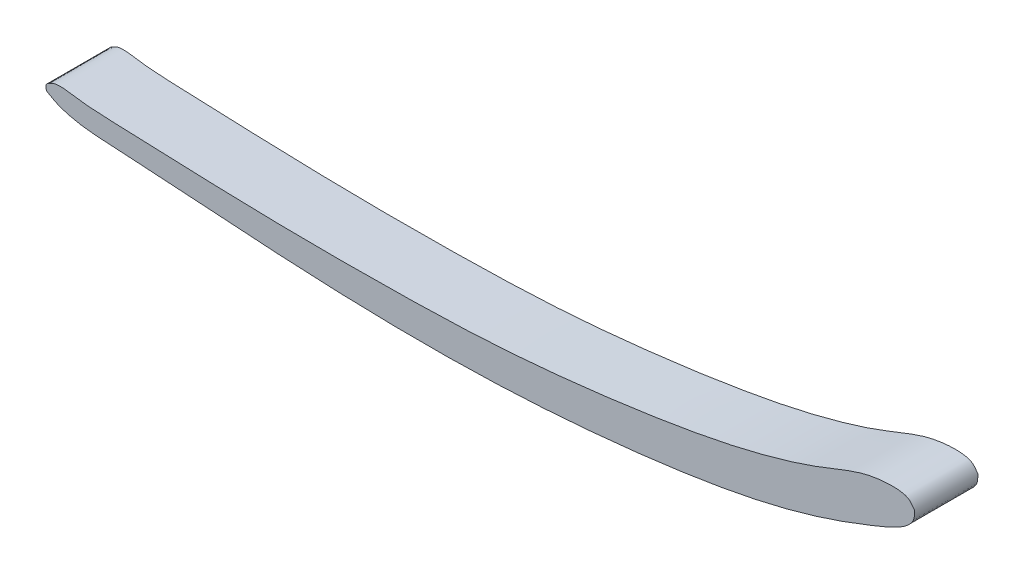
ISO-10303-21;
HEADER;
FILE_DESCRIPTION(('STEP AP214'),'2;1');
FILE_NAME('part.step','',(''),(''),'','','');
FILE_SCHEMA(('AUTOMOTIVE_DESIGN { 1 0 10303 214 1 1 1 1 }'));
ENDSEC;
DATA;
#1=APPLICATION_CONTEXT('core data for automotive mechanical design processes');
#2=APPLICATION_PROTOCOL_DEFINITION('international standard','automotive_design',2000,#1);
#3=PRODUCT_CONTEXT('',#1,'mechanical');
#4=PRODUCT('Part','Part','',(#3));
#5=PRODUCT_RELATED_PRODUCT_CATEGORY('part','',(#4));
#6=PRODUCT_DEFINITION_FORMATION('','',#4);
#7=PRODUCT_DEFINITION_CONTEXT('part definition',#1,'design');
#8=PRODUCT_DEFINITION('design','',#6,#7);
#9=PRODUCT_DEFINITION_SHAPE('','',#8);
#10=(LENGTH_UNIT() NAMED_UNIT(*) SI_UNIT(.MILLI.,.METRE.));
#11=(NAMED_UNIT(*) PLANE_ANGLE_UNIT() SI_UNIT($,.RADIAN.));
#12=(NAMED_UNIT(*) SI_UNIT($,.STERADIAN.) SOLID_ANGLE_UNIT());
#13=UNCERTAINTY_MEASURE_WITH_UNIT(LENGTH_MEASURE(1.E-05),#10,'distance_accuracy_value','');
#14=(GEOMETRIC_REPRESENTATION_CONTEXT(3) GLOBAL_UNCERTAINTY_ASSIGNED_CONTEXT((#13)) GLOBAL_UNIT_ASSIGNED_CONTEXT((#10,
#11,#12)) REPRESENTATION_CONTEXT('',''));
#15=CARTESIAN_POINT('',(0.,0.,0.));
#16=DIRECTION('',(0.,0.,1.));
#17=DIRECTION('',(1.,0.,0.));
#18=AXIS2_PLACEMENT_3D('',#15,#16,#17);
#19=CARTESIAN_POINT('',(41.656059354122,0.,476.));
#20=CARTESIAN_POINT('',(41.6411622522607,0.0745656319227003,476.));
#21=CARTESIAN_POINT('',(41.599875086542,0.138136223866402,476.));
#22=CARTESIAN_POINT('',(41.5123259849444,0.2598381366931,476.));
#23=CARTESIAN_POINT('',(41.4649652367241,0.317921392325511,476.));
#24=CARTESIAN_POINT('',(41.326790070313,0.495186504517943,476.));
#25=CARTESIAN_POINT('',(41.2353961147345,0.615123243591371,476.));
#26=CARTESIAN_POINT('',(41.0801421065875,0.775409706172896,476.));
#27=CARTESIAN_POINT('',(41.0257568422842,0.825777786115256,476.));
#28=CARTESIAN_POINT('',(40.9077762239397,0.915811415103947,476.));
#29=CARTESIAN_POINT('',(40.8440565762179,0.956041321608349,476.));
#30=CARTESIAN_POINT('',(40.6443731332833,1.06202801774388,476.));
#31=CARTESIAN_POINT('',(40.5040778067732,1.11172794332347,476.));
#32=CARTESIAN_POINT('',(40.2166389891778,1.19111910483424,476.));
#33=CARTESIAN_POINT('',(40.0688358258273,1.22020192061145,476.));
#34=CARTESIAN_POINT('',(39.7744975728023,1.26679206205951,476.));
#35=CARTESIAN_POINT('',(39.6271339065498,1.28400075489716,476.));
#36=CARTESIAN_POINT('',(39.1845310386129,1.31961247431741,476.));
#37=CARTESIAN_POINT('',(38.8888272142589,1.32347929795409,476.));
#38=CARTESIAN_POINT('',(38.0008155499215,1.30691634954785,476.));
#39=CARTESIAN_POINT('',(37.4057200585186,1.25289002388385,476.));
#40=CARTESIAN_POINT('',(36.2396160438054,1.08112770334556,476.));
#41=CARTESIAN_POINT('',(35.6656226189178,0.960683708931348,476.));
#42=CARTESIAN_POINT('',(33.9691559768438,0.502004987980635,476.));
#43=CARTESIAN_POINT('',(32.8697564376551,0.0750670066635498,476.));
#44=CARTESIAN_POINT('',(30.6760232761779,-0.795078602450539,476.));
#45=CARTESIAN_POINT('',(29.578746017737,-1.22884511673044,476.));
#46=CARTESIAN_POINT('',(27.3584199363584,-2.01440353612838,476.));
#47=CARTESIAN_POINT('',(26.2366581381468,-2.37028923031119,476.));
#48=CARTESIAN_POINT('',(23.9777292995895,-3.03305937534354,476.));
#49=CARTESIAN_POINT('',(22.840608045447,-3.34008946368883,476.));
#50=CARTESIAN_POINT('',(20.5550172725716,-3.91805289683216,476.));
#51=CARTESIAN_POINT('',(19.4055542832042,-4.18781663477288,476.));
#52=CARTESIAN_POINT('',(17.0995406477047,-4.68868418109729,476.));
#53=CARTESIAN_POINT('',(15.942732773791,-4.9203970810676,476.));
#54=CARTESIAN_POINT('',(12.4634363422635,-5.57183562509925,476.));
#55=CARTESIAN_POINT('',(10.1335971690307,-5.94986010040581,476.));
#56=CARTESIAN_POINT('',(5.46603753228869,-6.63936713804074,476.));
#57=CARTESIAN_POINT('',(3.12707920104473,-6.94844879440594,476.));
#58=CARTESIAN_POINT('',(-1.55974353162863,-7.50526319897706,476.));
#59=CARTESIAN_POINT('',(-3.90610999950208,-7.75298394646187,476.));
#60=CARTESIAN_POINT('',(-8.60582037120204,-8.16740204432664,476.));
#61=CARTESIAN_POINT('',(-10.9599295218898,-8.33242329183359,476.));
#62=CARTESIAN_POINT('',(-15.67344338439,-8.57736018992779,476.));
#63=CARTESIAN_POINT('',(-18.0314796863121,-8.65834342906753,476.));
#64=CARTESIAN_POINT('',(-22.7490104826822,-8.77302617296814,476.));
#65=CARTESIAN_POINT('',(-25.1086511613516,-8.80764244933431,476.));
#66=CARTESIAN_POINT('',(-29.8278964468394,-8.84634896351519,476.));
#67=CARTESIAN_POINT('',(-32.1874991251422,-8.84987628324567,476.));
#68=CARTESIAN_POINT('',(-36.9066541166952,-8.81700623053736,476.));
#69=CARTESIAN_POINT('',(-39.2663221859982,-8.78042927846728,476.));
#70=CARTESIAN_POINT('',(-43.9846166213349,-8.66992138592197,476.));
#71=CARTESIAN_POINT('',(-46.3433874207373,-8.59766558309423,476.));
#72=CARTESIAN_POINT('',(-51.0603442514039,-8.43764624387444,476.));
#73=CARTESIAN_POINT('',(-53.4186054472226,-8.35126682536733,476.));
#74=CARTESIAN_POINT('',(-56.9557665851521,-8.21587135787692,476.));
#75=CARTESIAN_POINT('',(-58.1347421032148,-8.16864059808202,476.));
#76=CARTESIAN_POINT('',(-59.9029633549886,-8.09218229887949,476.));
#77=CARTESIAN_POINT('',(-60.4924285244922,-8.06803312977843,476.));
#78=CARTESIAN_POINT('',(-61.6709665667264,-8.01070546653201,476.));
#79=CARTESIAN_POINT('',(-62.2598059278311,-7.9775877836907,476.));
#80=CARTESIAN_POINT('',(-63.4338481910908,-7.87548598580615,476.));
#81=CARTESIAN_POINT('',(-64.0190929900461,-7.80682172094238,476.));
#82=CARTESIAN_POINT('',(-64.8940635688195,-7.67510366427916,476.));
#83=CARTESIAN_POINT('',(-65.1854095246835,-7.6272478613896,476.));
#84=CARTESIAN_POINT('',(-65.7698363240156,-7.55314007612264,476.));
#85=CARTESIAN_POINT('',(-66.0626183769325,-7.52424586474919,476.));
#86=CARTESIAN_POINT('',(-66.5047346030952,-7.52313615306412,476.));
#87=CARTESIAN_POINT('',(-66.6535199274021,-7.5305442849246,476.));
#88=CARTESIAN_POINT('',(-66.9434646290674,-7.5701911016053,476.));
#89=CARTESIAN_POINT('',(-67.0852210506699,-7.6028825472795,476.));
#90=CARTESIAN_POINT('',(-67.3605662392593,-7.70094702985738,476.));
#91=CARTESIAN_POINT('',(-67.495029956487,-7.76567761164343,476.));
#92=CARTESIAN_POINT('',(-67.690375139116,-7.87235235935607,476.));
#93=CARTESIAN_POINT('',(-67.7542955794921,-7.91016965677373,476.));
#94=CARTESIAN_POINT('',(-67.8812029114201,-7.98724058513402,476.));
#95=CARTESIAN_POINT('',(-67.946756447238,-8.02358480506687,476.));
#96=CARTESIAN_POINT('',(-68.0604178682852,-8.11896236430099,476.));
#97=CARTESIAN_POINT('',(-68.1031390541075,-8.18234620854449,476.));
#98=CARTESIAN_POINT('',(-68.1497657523376,-8.32279274417433,476.));
#99=CARTESIAN_POINT('',(-68.1521672319965,-8.3980544622457,476.));
#100=CARTESIAN_POINT('',(-68.1456758272637,-8.54602106392083,476.));
#101=CARTESIAN_POINT('',(-68.1408314720423,-8.61996481679637,476.));
#102=CARTESIAN_POINT('',(-68.1133539909969,-8.76583308748999,476.));
#103=CARTESIAN_POINT('',(-68.0892783598684,-8.83837355292791,476.));
#104=CARTESIAN_POINT('',(-67.9999361897581,-8.95506582215182,476.));
#105=CARTESIAN_POINT('',(-67.9356000885031,-8.99589850782444,476.));
#106=CARTESIAN_POINT('',(-67.805910734232,-9.0648906723025,476.));
#107=CARTESIAN_POINT('',(-67.7388156405487,-9.09560635467722,476.));
#108=CARTESIAN_POINT('',(-67.5425508665902,-9.19668334028624,476.));
#109=CARTESIAN_POINT('',(-67.4148041969059,-9.26988178846623,476.));
#110=CARTESIAN_POINT('',(-67.158948345859,-9.41559805884382,476.));
#111=CARTESIAN_POINT('',(-67.0306351924745,-9.48773291777123,476.));
#112=CARTESIAN_POINT('',(-66.7668938248642,-9.61864390661332,476.));
#113=CARTESIAN_POINT('',(-66.6319824929752,-9.67822481677409,476.));
#114=CARTESIAN_POINT('',(-66.2249072503164,-9.84226703451248,476.));
#115=CARTESIAN_POINT('',(-65.9487295406194,-9.93329791509154,476.));
#116=CARTESIAN_POINT('',(-65.1134960361629,-10.180771785631,476.));
#117=CARTESIAN_POINT('',(-64.5464709422099,-10.306744295727,476.));
#118=CARTESIAN_POINT('',(-63.3967441582376,-10.4987501176073,476.));
#119=CARTESIAN_POINT('',(-62.8151038624989,-10.5657214750018,476.));
#120=CARTESIAN_POINT('',(-61.6528623207659,-10.6744206370753,476.));
#121=CARTESIAN_POINT('',(-61.0706236880044,-10.7155050787344,476.));
#122=CARTESIAN_POINT('',(-59.3227143719973,-10.8245966789952,476.));
#123=CARTESIAN_POINT('',(-58.156263719605,-10.8818951120884,476.));
#124=CARTESIAN_POINT('',(-55.8243033074842,-11.0088004190595,476.));
#125=CARTESIAN_POINT('',(-54.6585529405531,-11.0762239556743,476.));
#126=CARTESIAN_POINT('',(-51.1622136842119,-11.2942483136256,476.));
#127=CARTESIAN_POINT('',(-48.8324862834028,-11.4589533308981,476.));
#128=CARTESIAN_POINT('',(-44.1723865725282,-11.7773556738059,476.));
#129=CARTESIAN_POINT('',(-41.8419674291939,-11.930783494679,476.));
#130=CARTESIAN_POINT('',(-34.8474546045703,-12.3401729676022,476.));
#131=CARTESIAN_POINT('',(-30.1806486247097,-12.5426048718411,476.));
#132=CARTESIAN_POINT('',(-20.8416240165399,-12.7179494924376,476.));
#133=CARTESIAN_POINT('',(-16.1690919982502,-12.6949028197688,476.));
#134=CARTESIAN_POINT('',(-6.83623551571093,-12.357347440748,476.));
#135=CARTESIAN_POINT('',(-2.17229057516247,-12.0417791305582,476.));
#136=CARTESIAN_POINT('',(4.80181468854188,-11.3640376476286,476.));
#137=CARTESIAN_POINT('',(7.12228826971774,-11.1053914487185,476.));
#138=CARTESIAN_POINT('',(11.7531576902196,-10.5100822911382,476.));
#139=CARTESIAN_POINT('',(14.0638902593571,-10.1760261236726,476.));
#140=CARTESIAN_POINT('',(18.6709487306098,-9.39638468859501,476.));
#141=CARTESIAN_POINT('',(20.9639632760597,-8.95092856593287,476.));
#142=CARTESIAN_POINT('',(25.5135538698548,-7.89308161396524,476.));
#143=CARTESIAN_POINT('',(27.7701892147909,-7.27959159094672,476.));
#144=CARTESIAN_POINT('',(32.2211886981447,-5.85692748123369,476.));
#145=CARTESIAN_POINT('',(34.4162467818469,-5.04911056546946,476.));
#146=CARTESIAN_POINT('',(37.1222366744191,-3.94845302059224,476.));
#147=CARTESIAN_POINT('',(37.6617464458415,-3.72375013637632,476.));
#148=CARTESIAN_POINT('',(38.4626559292222,-3.36826927435174,476.));
#149=CARTESIAN_POINT('',(38.7279907450688,-3.24611983525079,476.));
#150=CARTESIAN_POINT('',(39.2529751137952,-2.98910894650334,476.));
#151=CARTESIAN_POINT('',(39.5122734451977,-2.85516349103267,476.));
#152=CARTESIAN_POINT('',(40.0166977288432,-2.56429610084689,476.));
#153=CARTESIAN_POINT('',(40.2619563483756,-2.40748643047174,476.));
#154=CARTESIAN_POINT('',(40.7282112575348,-2.05417387327939,476.));
#155=CARTESIAN_POINT('',(40.9471359407931,-1.8566546011801,476.));
#156=CARTESIAN_POINT('',(41.232491221487,-1.52381870305079,476.));
#157=CARTESIAN_POINT('',(41.3217412958915,-1.40529627296967,476.));
#158=CARTESIAN_POINT('',(41.4718600188819,-1.15447379668126,476.));
#159=CARTESIAN_POINT('',(41.5338656004132,-1.0223078565062,476.));
#160=CARTESIAN_POINT('',(41.6073471046207,-0.734336539151004,476.));
#161=CARTESIAN_POINT('',(41.6153338099253,-0.586874343492506,476.));
#162=CARTESIAN_POINT('',(41.6313611160118,-0.366170386615065,476.));
#163=CARTESIAN_POINT('',(41.6400074358257,-0.293001860465603,476.));
#164=CARTESIAN_POINT('',(41.6586089320643,-0.146823056793075,476.));
#165=CARTESIAN_POINT('',(41.6709564559833,-0.0745656319227003,476.));
#166=CARTESIAN_POINT('',(41.656059354122,0.,476.));
#167=B_SPLINE_CURVE_WITH_KNOTS('',3,(#19,#20,#21,#22,#23,#24,#25,#26,#27,#28,#29,#30,#31,#32,
#33,#34,#35,#36,#37,#38,#39,#40,#41,#42,#43,#44,#45,#46,#47,#48,#49,#50,#51,#52,#53,#54,#55,#56,
#57,#58,#59,#60,#61,#62,#63,#64,#65,#66,#67,#68,#69,#70,#71,#72,#73,#74,#75,#76,#77,#78,#79,#80,
#81,#82,#83,#84,#85,#86,#87,#88,#89,#90,#91,#92,#93,#94,#95,#96,#97,#98,#99,#100,#101,#102,#103,
#104,#105,#106,#107,#108,#109,#110,#111,#112,#113,#114,#115,#116,#117,#118,#119,#120,#121,#122,
#123,#124,#125,#126,#127,#128,#129,#130,#131,#132,#133,#134,#135,#136,#137,#138,#139,#140,#141,
#142,#143,#144,#145,#146,#147,#148,#149,#150,#151,#152,#153,#154,#155,#156,#157,#158,#159,#160,
#161,#162,#163,#164,#165,#166),.UNSPECIFIED.,.T.,.F.,(4,2,2,2,2,2,2,2,2,2,2,2,2,2,2,2,2,2,2,2,2,
2,2,2,2,2,2,2,2,2,2,2,2,2,2,2,2,2,2,2,2,2,2,2,2,2,2,2,2,2,2,2,2,2,2,2,2,2,2,2,2,2,2,2,2,2,2,2,2,
2,2,2,2,4),(0.,0.000976562500000093,0.00195312500000019,0.00390625000000032,0.00488281250000038,
0.00585937500000045,0.0078125000000005,0.00976562500000055,0.0117187500000006,
0.0156250000000006,0.0234375000000006,0.0312500000000006,0.0468750000000006,0.0625000000000006,
0.0781250000000006,0.0937500000000006,0.109375000000001,0.125000000000001,0.15625,0.1875,
0.21875,0.25,0.28125,0.3125,0.34375,0.375,0.40625,0.4375,0.453125,0.4609375,0.468749999999999,
0.4765625,0.48046875,0.484374999999999,0.486328125,0.48828125,0.490234375,0.4912109375,
0.4921875,0.4931640625,0.494140625,0.4951171875,0.49609375,0.4970703125,0.498046875,0.5,
0.501953125,0.50390625,0.5078125,0.515625,0.5234375,0.531250000000001,0.546875,0.5625,0.59375,
0.625,0.6875,0.75,0.8125,0.84375,0.875,0.90625,0.9375,0.96875,0.9765625,0.98046875,0.984375,
0.98828125,0.9921875,0.994140625,0.99609375,0.998046875,0.9990234375,1.),.UNSPECIFIED.);
#168=DIRECTION('',(0.,0.,-1.));
#169=VECTOR('',#168,1.);
#170=SURFACE_OF_LINEAR_EXTRUSION('',#167,#169);
#171=CARTESIAN_POINT('',(41.656059354122,0.,476.));
#172=CARTESIAN_POINT('',(41.6709564559833,-0.0745656319227003,476.));
#173=CARTESIAN_POINT('',(41.6586089320643,-0.146823056793075,476.));
#174=CARTESIAN_POINT('',(41.6400074358257,-0.293001860465603,476.));
#175=CARTESIAN_POINT('',(41.6313611160118,-0.366170386615065,476.));
#176=CARTESIAN_POINT('',(41.6153338099253,-0.586874343492506,476.));
#177=CARTESIAN_POINT('',(41.6073471046207,-0.734336539151004,476.));
#178=CARTESIAN_POINT('',(41.5338656004132,-1.0223078565062,476.));
#179=CARTESIAN_POINT('',(41.4718600188819,-1.15447379668126,476.));
#180=CARTESIAN_POINT('',(41.3217412958915,-1.40529627296967,476.));
#181=CARTESIAN_POINT('',(41.232491221487,-1.52381870305079,476.));
#182=CARTESIAN_POINT('',(40.9471359407931,-1.8566546011801,476.));
#183=CARTESIAN_POINT('',(40.7282112575348,-2.05417387327939,476.));
#184=CARTESIAN_POINT('',(40.2619563483756,-2.40748643047174,476.));
#185=CARTESIAN_POINT('',(40.0166977288432,-2.56429610084689,476.));
#186=CARTESIAN_POINT('',(39.5122734451977,-2.85516349103267,476.));
#187=CARTESIAN_POINT('',(39.2529751137952,-2.98910894650334,476.));
#188=CARTESIAN_POINT('',(38.7279907450688,-3.24611983525079,476.));
#189=CARTESIAN_POINT('',(38.4626559292222,-3.36826927435174,476.));
#190=CARTESIAN_POINT('',(37.6617464458415,-3.72375013637632,476.));
#191=CARTESIAN_POINT('',(37.1222366744191,-3.94845302059224,476.));
#192=CARTESIAN_POINT('',(34.4162467818469,-5.04911056546946,476.));
#193=CARTESIAN_POINT('',(32.2211886981447,-5.85692748123369,476.));
#194=CARTESIAN_POINT('',(27.7701892147909,-7.27959159094672,476.));
#195=CARTESIAN_POINT('',(25.5135538698548,-7.89308161396524,476.));
#196=CARTESIAN_POINT('',(20.9639632760597,-8.95092856593287,476.));
#197=CARTESIAN_POINT('',(18.6709487306098,-9.39638468859501,476.));
#198=CARTESIAN_POINT('',(14.0638902593571,-10.1760261236726,476.));
#199=CARTESIAN_POINT('',(11.7531576902196,-10.5100822911382,476.));
#200=CARTESIAN_POINT('',(7.12228826971774,-11.1053914487185,476.));
#201=CARTESIAN_POINT('',(4.80181468854188,-11.3640376476286,476.));
#202=CARTESIAN_POINT('',(-2.17229057516247,-12.0417791305582,476.));
#203=CARTESIAN_POINT('',(-6.83623551571093,-12.357347440748,476.));
#204=CARTESIAN_POINT('',(-16.1690919982502,-12.6949028197688,476.));
#205=CARTESIAN_POINT('',(-20.8416240165399,-12.7179494924376,476.));
#206=CARTESIAN_POINT('',(-30.1806486247097,-12.5426048718411,476.));
#207=CARTESIAN_POINT('',(-34.8474546045703,-12.3401729676022,476.));
#208=CARTESIAN_POINT('',(-41.8419674291939,-11.930783494679,476.));
#209=CARTESIAN_POINT('',(-44.1723865725282,-11.7773556738059,476.));
#210=CARTESIAN_POINT('',(-48.8324862834028,-11.4589533308981,476.));
#211=CARTESIAN_POINT('',(-51.1622136842119,-11.2942483136256,476.));
#212=CARTESIAN_POINT('',(-54.6585529405531,-11.0762239556743,476.));
#213=CARTESIAN_POINT('',(-55.8243033074842,-11.0088004190595,476.));
#214=CARTESIAN_POINT('',(-58.156263719605,-10.8818951120884,476.));
#215=CARTESIAN_POINT('',(-59.3227143719973,-10.8245966789952,476.));
#216=CARTESIAN_POINT('',(-61.0706236880044,-10.7155050787344,476.));
#217=CARTESIAN_POINT('',(-61.6528623207659,-10.6744206370753,476.));
#218=CARTESIAN_POINT('',(-62.8151038624989,-10.5657214750018,476.));
#219=CARTESIAN_POINT('',(-63.3967441582376,-10.4987501176073,476.));
#220=CARTESIAN_POINT('',(-64.5464709422099,-10.306744295727,476.));
#221=CARTESIAN_POINT('',(-65.1134960361629,-10.180771785631,476.));
#222=CARTESIAN_POINT('',(-65.9487295406194,-9.93329791509154,476.));
#223=CARTESIAN_POINT('',(-66.2249072503164,-9.84226703451248,476.));
#224=CARTESIAN_POINT('',(-66.6319824929752,-9.67822481677409,476.));
#225=CARTESIAN_POINT('',(-66.7668938248642,-9.61864390661332,476.));
#226=CARTESIAN_POINT('',(-67.0306351924745,-9.48773291777123,476.));
#227=CARTESIAN_POINT('',(-67.158948345859,-9.41559805884382,476.));
#228=CARTESIAN_POINT('',(-67.4148041969059,-9.26988178846623,476.));
#229=CARTESIAN_POINT('',(-67.5425508665902,-9.19668334028624,476.));
#230=CARTESIAN_POINT('',(-67.7388156405487,-9.09560635467722,476.));
#231=CARTESIAN_POINT('',(-67.805910734232,-9.0648906723025,476.));
#232=CARTESIAN_POINT('',(-67.9356000885031,-8.99589850782444,476.));
#233=CARTESIAN_POINT('',(-67.9999361897581,-8.95506582215182,476.));
#234=CARTESIAN_POINT('',(-68.0892783598684,-8.83837355292791,476.));
#235=CARTESIAN_POINT('',(-68.1133539909969,-8.76583308748999,476.));
#236=CARTESIAN_POINT('',(-68.1408314720423,-8.61996481679637,476.));
#237=CARTESIAN_POINT('',(-68.1456758272637,-8.54602106392083,476.));
#238=CARTESIAN_POINT('',(-68.1521672319965,-8.3980544622457,476.));
#239=CARTESIAN_POINT('',(-68.1497657523376,-8.32279274417433,476.));
#240=CARTESIAN_POINT('',(-68.1031390541075,-8.18234620854449,476.));
#241=CARTESIAN_POINT('',(-68.0604178682852,-8.11896236430099,476.));
#242=CARTESIAN_POINT('',(-67.946756447238,-8.02358480506687,476.));
#243=CARTESIAN_POINT('',(-67.8812029114201,-7.98724058513402,476.));
#244=CARTESIAN_POINT('',(-67.7542955794921,-7.91016965677373,476.));
#245=CARTESIAN_POINT('',(-67.690375139116,-7.87235235935607,476.));
#246=CARTESIAN_POINT('',(-67.495029956487,-7.76567761164343,476.));
#247=CARTESIAN_POINT('',(-67.3605662392593,-7.70094702985738,476.));
#248=CARTESIAN_POINT('',(-67.0852210506699,-7.6028825472795,476.));
#249=CARTESIAN_POINT('',(-66.9434646290674,-7.5701911016053,476.));
#250=CARTESIAN_POINT('',(-66.6535199274021,-7.5305442849246,476.));
#251=CARTESIAN_POINT('',(-66.5047346030952,-7.52313615306412,476.));
#252=CARTESIAN_POINT('',(-66.0626183769325,-7.52424586474919,476.));
#253=CARTESIAN_POINT('',(-65.7698363240156,-7.55314007612264,476.));
#254=CARTESIAN_POINT('',(-65.1854095246835,-7.6272478613896,476.));
#255=CARTESIAN_POINT('',(-64.8940635688195,-7.67510366427916,476.));
#256=CARTESIAN_POINT('',(-64.0190929900461,-7.80682172094238,476.));
#257=CARTESIAN_POINT('',(-63.4338481910908,-7.87548598580615,476.));
#258=CARTESIAN_POINT('',(-62.2598059278311,-7.9775877836907,476.));
#259=CARTESIAN_POINT('',(-61.6709665667264,-8.01070546653201,476.));
#260=CARTESIAN_POINT('',(-60.4924285244922,-8.06803312977843,476.));
#261=CARTESIAN_POINT('',(-59.9029633549886,-8.09218229887949,476.));
#262=CARTESIAN_POINT('',(-58.1347421032148,-8.16864059808202,476.));
#263=CARTESIAN_POINT('',(-56.9557665851521,-8.21587135787692,476.));
#264=CARTESIAN_POINT('',(-53.4186054472226,-8.35126682536733,476.));
#265=CARTESIAN_POINT('',(-51.0603442514039,-8.43764624387444,476.));
#266=CARTESIAN_POINT('',(-46.3433874207373,-8.59766558309423,476.));
#267=CARTESIAN_POINT('',(-43.9846166213349,-8.66992138592197,476.));
#268=CARTESIAN_POINT('',(-39.2663221859982,-8.78042927846728,476.));
#269=CARTESIAN_POINT('',(-36.9066541166952,-8.81700623053736,476.));
#270=CARTESIAN_POINT('',(-32.1874991251422,-8.84987628324567,476.));
#271=CARTESIAN_POINT('',(-29.8278964468394,-8.84634896351519,476.));
#272=CARTESIAN_POINT('',(-25.1086511613516,-8.80764244933431,476.));
#273=CARTESIAN_POINT('',(-22.7490104826822,-8.77302617296814,476.));
#274=CARTESIAN_POINT('',(-18.0314796863121,-8.65834342906753,476.));
#275=CARTESIAN_POINT('',(-15.67344338439,-8.57736018992779,476.));
#276=CARTESIAN_POINT('',(-10.9599295218898,-8.33242329183359,476.));
#277=CARTESIAN_POINT('',(-8.60582037120204,-8.16740204432664,476.));
#278=CARTESIAN_POINT('',(-3.90610999950208,-7.75298394646187,476.));
#279=CARTESIAN_POINT('',(-1.55974353162863,-7.50526319897706,476.));
#280=CARTESIAN_POINT('',(3.12707920104473,-6.94844879440594,476.));
#281=CARTESIAN_POINT('',(5.46603753228869,-6.63936713804074,476.));
#282=CARTESIAN_POINT('',(10.1335971690307,-5.94986010040581,476.));
#283=CARTESIAN_POINT('',(12.4634363422635,-5.57183562509925,476.));
#284=CARTESIAN_POINT('',(15.942732773791,-4.9203970810676,476.));
#285=CARTESIAN_POINT('',(17.0995406477047,-4.68868418109729,476.));
#286=CARTESIAN_POINT('',(19.4055542832042,-4.18781663477288,476.));
#287=CARTESIAN_POINT('',(20.5550172725716,-3.91805289683216,476.));
#288=CARTESIAN_POINT('',(22.840608045447,-3.34008946368883,476.));
#289=CARTESIAN_POINT('',(23.9777292995895,-3.03305937534354,476.));
#290=CARTESIAN_POINT('',(26.2366581381468,-2.37028923031119,476.));
#291=CARTESIAN_POINT('',(27.3584199363584,-2.01440353612838,476.));
#292=CARTESIAN_POINT('',(29.578746017737,-1.22884511673044,476.));
#293=CARTESIAN_POINT('',(30.6760232761779,-0.795078602450539,476.));
#294=CARTESIAN_POINT('',(32.8697564376551,0.0750670066635498,476.));
#295=CARTESIAN_POINT('',(33.9691559768438,0.502004987980635,476.));
#296=CARTESIAN_POINT('',(35.6656226189178,0.960683708931348,476.));
#297=CARTESIAN_POINT('',(36.2396160438054,1.08112770334556,476.));
#298=CARTESIAN_POINT('',(37.4057200585186,1.25289002388385,476.));
#299=CARTESIAN_POINT('',(38.0008155499215,1.30691634954785,476.));
#300=CARTESIAN_POINT('',(38.8888272142589,1.32347929795409,476.));
#301=CARTESIAN_POINT('',(39.1845310386129,1.31961247431741,476.));
#302=CARTESIAN_POINT('',(39.6271339065498,1.28400075489716,476.));
#303=CARTESIAN_POINT('',(39.7744975728023,1.26679206205951,476.));
#304=CARTESIAN_POINT('',(40.0688358258273,1.22020192061145,476.));
#305=CARTESIAN_POINT('',(40.2166389891778,1.19111910483424,476.));
#306=CARTESIAN_POINT('',(40.5040778067732,1.11172794332347,476.));
#307=CARTESIAN_POINT('',(40.6443731332833,1.06202801774388,476.));
#308=CARTESIAN_POINT('',(40.8440565762179,0.956041321608349,476.));
#309=CARTESIAN_POINT('',(40.9077762239397,0.915811415103947,476.));
#310=CARTESIAN_POINT('',(41.0257568422842,0.825777786115256,476.));
#311=CARTESIAN_POINT('',(41.0801421065875,0.775409706172896,476.));
#312=CARTESIAN_POINT('',(41.2353961147345,0.615123243591371,476.));
#313=CARTESIAN_POINT('',(41.326790070313,0.495186504517943,476.));
#314=CARTESIAN_POINT('',(41.4649652367241,0.317921392325511,476.));
#315=CARTESIAN_POINT('',(41.5123259849444,0.2598381366931,476.));
#316=CARTESIAN_POINT('',(41.599875086542,0.138136223866402,476.));
#317=CARTESIAN_POINT('',(41.6411622522607,0.0745656319227003,476.));
#318=CARTESIAN_POINT('',(41.656059354122,0.,476.));
#319=B_SPLINE_CURVE_WITH_KNOTS('',3,(#171,#172,#173,#174,#175,#176,#177,#178,#179,#180,#181,
#182,#183,#184,#185,#186,#187,#188,#189,#190,#191,#192,#193,#194,#195,#196,#197,#198,#199,#200,
#201,#202,#203,#204,#205,#206,#207,#208,#209,#210,#211,#212,#213,#214,#215,#216,#217,#218,#219,
#220,#221,#222,#223,#224,#225,#226,#227,#228,#229,#230,#231,#232,#233,#234,#235,#236,#237,#238,
#239,#240,#241,#242,#243,#244,#245,#246,#247,#248,#249,#250,#251,#252,#253,#254,#255,#256,#257,
#258,#259,#260,#261,#262,#263,#264,#265,#266,#267,#268,#269,#270,#271,#272,#273,#274,#275,#276,
#277,#278,#279,#280,#281,#282,#283,#284,#285,#286,#287,#288,#289,#290,#291,#292,#293,#294,#295,
#296,#297,#298,#299,#300,#301,#302,#303,#304,#305,#306,#307,#308,#309,#310,#311,#312,#313,#314,
#315,#316,#317,#318),.UNSPECIFIED.,.T.,.F.,(4,2,2,2,2,2,2,2,2,2,2,2,2,2,2,2,2,2,2,2,2,2,2,2,2,2,
2,2,2,2,2,2,2,2,2,2,2,2,2,2,2,2,2,2,2,2,2,2,2,2,2,2,2,2,2,2,2,2,2,2,2,2,2,2,2,2,2,2,2,2,2,2,2,
4),(0.,0.000976562499999889,0.00195312499999989,0.00390624999999989,0.005859375,
0.00781250000000011,0.0117187500000001,0.0156250000000001,0.0195312500000002,0.0234375000000002,
0.0312500000000002,0.0625000000000002,0.0937500000000001,0.125,0.15625,0.1875,0.25,0.3125,0.375,
0.40625,0.4375,0.453125,0.468749999999999,0.4765625,0.484375,0.4921875,0.49609375,0.498046875,
0.5,0.501953125,0.5029296875,0.50390625,0.5048828125,0.505859375,0.5068359375,0.5078125,
0.5087890625,0.509765625,0.51171875,0.513671875,0.515625000000001,0.51953125,0.5234375,
0.531250000000001,0.5390625,0.546875,0.5625,0.59375,0.625,0.65625,0.6875,0.71875,0.75,0.78125,
0.8125,0.84375,0.874999999999999,0.890624999999999,0.906249999999999,0.921874999999999,
0.937499999999999,0.953124999999999,0.968749999999999,0.976562499999999,0.984374999999999,
0.988281249999999,0.990234374999999,0.9921875,0.994140625,0.9951171875,0.99609375,0.998046875,
0.9990234375,1.),.UNSPECIFIED.);
#320=CARTESIAN_POINT('',(41.656059354122,0.,476.));
#321=VERTEX_POINT('',#320);
#322=EDGE_CURVE('E10',#321,#321,#319,.F.);
#323=ORIENTED_EDGE('',*,*,#322,.F.);
#324=EDGE_LOOP('',(#323));
#325=FACE_BOUND('',#324,.T.);
#326=CARTESIAN_POINT('',(41.656059354122,0.,468.));
#327=CARTESIAN_POINT('',(41.6411622522607,0.0745656319227003,468.));
#328=CARTESIAN_POINT('',(41.599875086542,0.138136223866402,468.));
#329=CARTESIAN_POINT('',(41.5123259849444,0.2598381366931,468.));
#330=CARTESIAN_POINT('',(41.4649652367241,0.317921392325511,468.));
#331=CARTESIAN_POINT('',(41.326790070313,0.495186504517943,468.));
#332=CARTESIAN_POINT('',(41.2353961147345,0.615123243591371,468.));
#333=CARTESIAN_POINT('',(41.0801421065875,0.775409706172896,468.));
#334=CARTESIAN_POINT('',(41.0257568422842,0.825777786115256,468.));
#335=CARTESIAN_POINT('',(40.9077762239397,0.915811415103947,468.));
#336=CARTESIAN_POINT('',(40.8440565762179,0.956041321608349,468.));
#337=CARTESIAN_POINT('',(40.6443731332833,1.06202801774388,468.));
#338=CARTESIAN_POINT('',(40.5040778067732,1.11172794332347,468.));
#339=CARTESIAN_POINT('',(40.2166389891778,1.19111910483424,468.));
#340=CARTESIAN_POINT('',(40.0688358258273,1.22020192061145,468.));
#341=CARTESIAN_POINT('',(39.7744975728023,1.26679206205951,468.));
#342=CARTESIAN_POINT('',(39.6271339065498,1.28400075489716,468.));
#343=CARTESIAN_POINT('',(39.1845310386129,1.31961247431741,468.));
#344=CARTESIAN_POINT('',(38.8888272142589,1.32347929795409,468.));
#345=CARTESIAN_POINT('',(38.0008155499215,1.30691634954785,468.));
#346=CARTESIAN_POINT('',(37.4057200585186,1.25289002388385,468.));
#347=CARTESIAN_POINT('',(36.2396160438054,1.08112770334556,468.));
#348=CARTESIAN_POINT('',(35.6656226189178,0.960683708931348,468.));
#349=CARTESIAN_POINT('',(33.9691559768438,0.502004987980635,468.));
#350=CARTESIAN_POINT('',(32.8697564376551,0.0750670066635498,468.));
#351=CARTESIAN_POINT('',(30.6760232761779,-0.795078602450539,468.));
#352=CARTESIAN_POINT('',(29.578746017737,-1.22884511673044,468.));
#353=CARTESIAN_POINT('',(27.3584199363584,-2.01440353612838,468.));
#354=CARTESIAN_POINT('',(26.2366581381468,-2.37028923031119,468.));
#355=CARTESIAN_POINT('',(23.9777292995895,-3.03305937534354,468.));
#356=CARTESIAN_POINT('',(22.840608045447,-3.34008946368883,468.));
#357=CARTESIAN_POINT('',(20.5550172725716,-3.91805289683216,468.));
#358=CARTESIAN_POINT('',(19.4055542832042,-4.18781663477288,468.));
#359=CARTESIAN_POINT('',(17.0995406477047,-4.68868418109729,468.));
#360=CARTESIAN_POINT('',(15.942732773791,-4.9203970810676,468.));
#361=CARTESIAN_POINT('',(12.4634363422635,-5.57183562509925,468.));
#362=CARTESIAN_POINT('',(10.1335971690307,-5.94986010040581,468.));
#363=CARTESIAN_POINT('',(5.46603753228869,-6.63936713804074,468.));
#364=CARTESIAN_POINT('',(3.12707920104473,-6.94844879440594,468.));
#365=CARTESIAN_POINT('',(-1.55974353162863,-7.50526319897706,468.));
#366=CARTESIAN_POINT('',(-3.90610999950208,-7.75298394646187,468.));
#367=CARTESIAN_POINT('',(-8.60582037120204,-8.16740204432664,468.));
#368=CARTESIAN_POINT('',(-10.9599295218898,-8.33242329183359,468.));
#369=CARTESIAN_POINT('',(-15.67344338439,-8.57736018992779,468.));
#370=CARTESIAN_POINT('',(-18.0314796863121,-8.65834342906753,468.));
#371=CARTESIAN_POINT('',(-22.7490104826822,-8.77302617296814,468.));
#372=CARTESIAN_POINT('',(-25.1086511613516,-8.80764244933431,468.));
#373=CARTESIAN_POINT('',(-29.8278964468394,-8.84634896351519,468.));
#374=CARTESIAN_POINT('',(-32.1874991251422,-8.84987628324567,468.));
#375=CARTESIAN_POINT('',(-36.9066541166952,-8.81700623053736,468.));
#376=CARTESIAN_POINT('',(-39.2663221859982,-8.78042927846728,468.));
#377=CARTESIAN_POINT('',(-43.9846166213349,-8.66992138592197,468.));
#378=CARTESIAN_POINT('',(-46.3433874207373,-8.59766558309423,468.));
#379=CARTESIAN_POINT('',(-51.0603442514039,-8.43764624387444,468.));
#380=CARTESIAN_POINT('',(-53.4186054472226,-8.35126682536733,468.));
#381=CARTESIAN_POINT('',(-56.9557665851521,-8.21587135787692,468.));
#382=CARTESIAN_POINT('',(-58.1347421032148,-8.16864059808202,468.));
#383=CARTESIAN_POINT('',(-59.9029633549886,-8.09218229887949,468.));
#384=CARTESIAN_POINT('',(-60.4924285244922,-8.06803312977843,468.));
#385=CARTESIAN_POINT('',(-61.6709665667264,-8.01070546653201,468.));
#386=CARTESIAN_POINT('',(-62.2598059278311,-7.9775877836907,468.));
#387=CARTESIAN_POINT('',(-63.4338481910908,-7.87548598580615,468.));
#388=CARTESIAN_POINT('',(-64.0190929900461,-7.80682172094238,468.));
#389=CARTESIAN_POINT('',(-64.8940635688195,-7.67510366427916,468.));
#390=CARTESIAN_POINT('',(-65.1854095246835,-7.6272478613896,468.));
#391=CARTESIAN_POINT('',(-65.7698363240156,-7.55314007612264,468.));
#392=CARTESIAN_POINT('',(-66.0626183769325,-7.52424586474919,468.));
#393=CARTESIAN_POINT('',(-66.5047346030952,-7.52313615306412,468.));
#394=CARTESIAN_POINT('',(-66.6535199274021,-7.5305442849246,468.));
#395=CARTESIAN_POINT('',(-66.9434646290674,-7.5701911016053,468.));
#396=CARTESIAN_POINT('',(-67.0852210506699,-7.6028825472795,468.));
#397=CARTESIAN_POINT('',(-67.3605662392593,-7.70094702985738,468.));
#398=CARTESIAN_POINT('',(-67.495029956487,-7.76567761164343,468.));
#399=CARTESIAN_POINT('',(-67.690375139116,-7.87235235935607,468.));
#400=CARTESIAN_POINT('',(-67.7542955794921,-7.91016965677373,468.));
#401=CARTESIAN_POINT('',(-67.8812029114201,-7.98724058513402,468.));
#402=CARTESIAN_POINT('',(-67.946756447238,-8.02358480506687,468.));
#403=CARTESIAN_POINT('',(-68.0604178682852,-8.11896236430099,468.));
#404=CARTESIAN_POINT('',(-68.1031390541075,-8.18234620854449,468.));
#405=CARTESIAN_POINT('',(-68.1497657523376,-8.32279274417433,468.));
#406=CARTESIAN_POINT('',(-68.1521672319965,-8.3980544622457,468.));
#407=CARTESIAN_POINT('',(-68.1456758272637,-8.54602106392083,468.));
#408=CARTESIAN_POINT('',(-68.1408314720423,-8.61996481679637,468.));
#409=CARTESIAN_POINT('',(-68.1133539909969,-8.76583308748999,468.));
#410=CARTESIAN_POINT('',(-68.0892783598684,-8.83837355292791,468.));
#411=CARTESIAN_POINT('',(-67.9999361897581,-8.95506582215182,468.));
#412=CARTESIAN_POINT('',(-67.9356000885031,-8.99589850782444,468.));
#413=CARTESIAN_POINT('',(-67.805910734232,-9.0648906723025,468.));
#414=CARTESIAN_POINT('',(-67.7388156405487,-9.09560635467722,468.));
#415=CARTESIAN_POINT('',(-67.5425508665902,-9.19668334028624,468.));
#416=CARTESIAN_POINT('',(-67.4148041969059,-9.26988178846623,468.));
#417=CARTESIAN_POINT('',(-67.158948345859,-9.41559805884382,468.));
#418=CARTESIAN_POINT('',(-67.0306351924745,-9.48773291777123,468.));
#419=CARTESIAN_POINT('',(-66.7668938248642,-9.61864390661332,468.));
#420=CARTESIAN_POINT('',(-66.6319824929752,-9.67822481677409,468.));
#421=CARTESIAN_POINT('',(-66.2249072503164,-9.84226703451248,468.));
#422=CARTESIAN_POINT('',(-65.9487295406194,-9.93329791509154,468.));
#423=CARTESIAN_POINT('',(-65.1134960361629,-10.180771785631,468.));
#424=CARTESIAN_POINT('',(-64.5464709422099,-10.306744295727,468.));
#425=CARTESIAN_POINT('',(-63.3967441582376,-10.4987501176073,468.));
#426=CARTESIAN_POINT('',(-62.8151038624989,-10.5657214750018,468.));
#427=CARTESIAN_POINT('',(-61.6528623207659,-10.6744206370753,468.));
#428=CARTESIAN_POINT('',(-61.0706236880044,-10.7155050787344,468.));
#429=CARTESIAN_POINT('',(-59.3227143719973,-10.8245966789952,468.));
#430=CARTESIAN_POINT('',(-58.156263719605,-10.8818951120884,468.));
#431=CARTESIAN_POINT('',(-55.8243033074842,-11.0088004190595,468.));
#432=CARTESIAN_POINT('',(-54.6585529405531,-11.0762239556743,468.));
#433=CARTESIAN_POINT('',(-51.1622136842119,-11.2942483136256,468.));
#434=CARTESIAN_POINT('',(-48.8324862834028,-11.4589533308981,468.));
#435=CARTESIAN_POINT('',(-44.1723865725282,-11.7773556738059,468.));
#436=CARTESIAN_POINT('',(-41.8419674291939,-11.930783494679,468.));
#437=CARTESIAN_POINT('',(-34.8474546045703,-12.3401729676022,468.));
#438=CARTESIAN_POINT('',(-30.1806486247097,-12.5426048718411,468.));
#439=CARTESIAN_POINT('',(-20.8416240165399,-12.7179494924376,468.));
#440=CARTESIAN_POINT('',(-16.1690919982502,-12.6949028197688,468.));
#441=CARTESIAN_POINT('',(-6.83623551571093,-12.357347440748,468.));
#442=CARTESIAN_POINT('',(-2.17229057516247,-12.0417791305582,468.));
#443=CARTESIAN_POINT('',(4.80181468854188,-11.3640376476286,468.));
#444=CARTESIAN_POINT('',(7.12228826971774,-11.1053914487185,468.));
#445=CARTESIAN_POINT('',(11.7531576902196,-10.5100822911382,468.));
#446=CARTESIAN_POINT('',(14.0638902593571,-10.1760261236726,468.));
#447=CARTESIAN_POINT('',(18.6709487306098,-9.39638468859501,468.));
#448=CARTESIAN_POINT('',(20.9639632760597,-8.95092856593287,468.));
#449=CARTESIAN_POINT('',(25.5135538698548,-7.89308161396524,468.));
#450=CARTESIAN_POINT('',(27.7701892147909,-7.27959159094672,468.));
#451=CARTESIAN_POINT('',(32.2211886981447,-5.85692748123369,468.));
#452=CARTESIAN_POINT('',(34.4162467818469,-5.04911056546946,468.));
#453=CARTESIAN_POINT('',(37.1222366744191,-3.94845302059224,468.));
#454=CARTESIAN_POINT('',(37.6617464458415,-3.72375013637632,468.));
#455=CARTESIAN_POINT('',(38.4626559292222,-3.36826927435174,468.));
#456=CARTESIAN_POINT('',(38.7279907450688,-3.24611983525079,468.));
#457=CARTESIAN_POINT('',(39.2529751137952,-2.98910894650334,468.));
#458=CARTESIAN_POINT('',(39.5122734451977,-2.85516349103267,468.));
#459=CARTESIAN_POINT('',(40.0166977288432,-2.56429610084689,468.));
#460=CARTESIAN_POINT('',(40.2619563483756,-2.40748643047174,468.));
#461=CARTESIAN_POINT('',(40.7282112575348,-2.05417387327939,468.));
#462=CARTESIAN_POINT('',(40.9471359407931,-1.8566546011801,468.));
#463=CARTESIAN_POINT('',(41.232491221487,-1.52381870305079,468.));
#464=CARTESIAN_POINT('',(41.3217412958915,-1.40529627296967,468.));
#465=CARTESIAN_POINT('',(41.4718600188819,-1.15447379668126,468.));
#466=CARTESIAN_POINT('',(41.5338656004132,-1.0223078565062,468.));
#467=CARTESIAN_POINT('',(41.6073471046207,-0.734336539151004,468.));
#468=CARTESIAN_POINT('',(41.6153338099253,-0.586874343492506,468.));
#469=CARTESIAN_POINT('',(41.6313611160118,-0.366170386615065,468.));
#470=CARTESIAN_POINT('',(41.6400074358257,-0.293001860465603,468.));
#471=CARTESIAN_POINT('',(41.6586089320643,-0.146823056793075,468.));
#472=CARTESIAN_POINT('',(41.6709564559833,-0.0745656319227003,468.));
#473=CARTESIAN_POINT('',(41.656059354122,0.,468.));
#474=B_SPLINE_CURVE_WITH_KNOTS('',3,(#326,#327,#328,#329,#330,#331,#332,#333,#334,#335,#336,
#337,#338,#339,#340,#341,#342,#343,#344,#345,#346,#347,#348,#349,#350,#351,#352,#353,#354,#355,
#356,#357,#358,#359,#360,#361,#362,#363,#364,#365,#366,#367,#368,#369,#370,#371,#372,#373,#374,
#375,#376,#377,#378,#379,#380,#381,#382,#383,#384,#385,#386,#387,#388,#389,#390,#391,#392,#393,
#394,#395,#396,#397,#398,#399,#400,#401,#402,#403,#404,#405,#406,#407,#408,#409,#410,#411,#412,
#413,#414,#415,#416,#417,#418,#419,#420,#421,#422,#423,#424,#425,#426,#427,#428,#429,#430,#431,
#432,#433,#434,#435,#436,#437,#438,#439,#440,#441,#442,#443,#444,#445,#446,#447,#448,#449,#450,
#451,#452,#453,#454,#455,#456,#457,#458,#459,#460,#461,#462,#463,#464,#465,#466,#467,#468,#469,
#470,#471,#472,#473),.UNSPECIFIED.,.T.,.F.,(4,2,2,2,2,2,2,2,2,2,2,2,2,2,2,2,2,2,2,2,2,2,2,2,2,2,
2,2,2,2,2,2,2,2,2,2,2,2,2,2,2,2,2,2,2,2,2,2,2,2,2,2,2,2,2,2,2,2,2,2,2,2,2,2,2,2,2,2,2,2,2,2,2,
4),(0.,0.000976562500000093,0.00195312500000019,0.00390625000000032,0.00488281250000038,
0.00585937500000045,0.0078125000000005,0.00976562500000055,0.0117187500000006,
0.0156250000000006,0.0234375000000006,0.0312500000000006,0.0468750000000006,0.0625000000000006,
0.0781250000000006,0.0937500000000006,0.109375000000001,0.125000000000001,0.15625,0.1875,
0.21875,0.25,0.28125,0.3125,0.34375,0.375,0.40625,0.4375,0.453125,0.4609375,0.468749999999999,
0.4765625,0.48046875,0.484374999999999,0.486328125,0.48828125,0.490234375,0.4912109375,
0.4921875,0.4931640625,0.494140625,0.4951171875,0.49609375,0.4970703125,0.498046875,0.5,
0.501953125,0.50390625,0.5078125,0.515625,0.5234375,0.531250000000001,0.546875,0.5625,0.59375,
0.625,0.6875,0.75,0.8125,0.84375,0.875,0.90625,0.9375,0.96875,0.9765625,0.98046875,0.984375,
0.98828125,0.9921875,0.994140625,0.99609375,0.998046875,0.9990234375,1.),.UNSPECIFIED.);
#475=CARTESIAN_POINT('',(41.656059354122,0.,468.));
#476=VERTEX_POINT('',#475);
#477=EDGE_CURVE('E38',#476,#476,#474,.T.);
#478=ORIENTED_EDGE('',*,*,#477,.T.);
#479=EDGE_LOOP('',(#478));
#480=FACE_BOUND('',#479,.T.);
#481=ADVANCED_FACE('F28',(#325,#480),#170,.F.);
#482=CARTESIAN_POINT('',(-67.2868762713825,-9.34273992365502,476.));
#483=DIRECTION('',(0.,0.,-1.));
#484=DIRECTION('',(-1.,0.,0.));
#485=AXIS2_PLACEMENT_3D('',#482,#483,#484);
#486=PLANE('',#485);
#487=ORIENTED_EDGE('',*,*,#322,.T.);
#488=EDGE_LOOP('',(#487));
#489=FACE_BOUND('',#488,.T.);
#490=ADVANCED_FACE('F69',(#489),#486,.F.);
#491=CARTESIAN_POINT('',(-67.2868762713825,-9.34273992365502,468.));
#492=DIRECTION('',(0.,0.,-1.));
#493=DIRECTION('',(-1.,0.,0.));
#494=AXIS2_PLACEMENT_3D('',#491,#492,#493);
#495=PLANE('',#494);
#496=ORIENTED_EDGE('',*,*,#477,.F.);
#497=EDGE_LOOP('',(#496));
#498=FACE_BOUND('',#497,.T.);
#499=ADVANCED_FACE('F77',(#498),#495,.T.);
#500=CLOSED_SHELL('',(#481,#490,#499));
#501=MANIFOLD_SOLID_BREP('B2',#500);
#502=ADVANCED_BREP_SHAPE_REPRESENTATION('',(#18,#501),#14);
#503=SHAPE_DEFINITION_REPRESENTATION(#9,#502);
ENDSEC;
END-ISO-10303-21;
